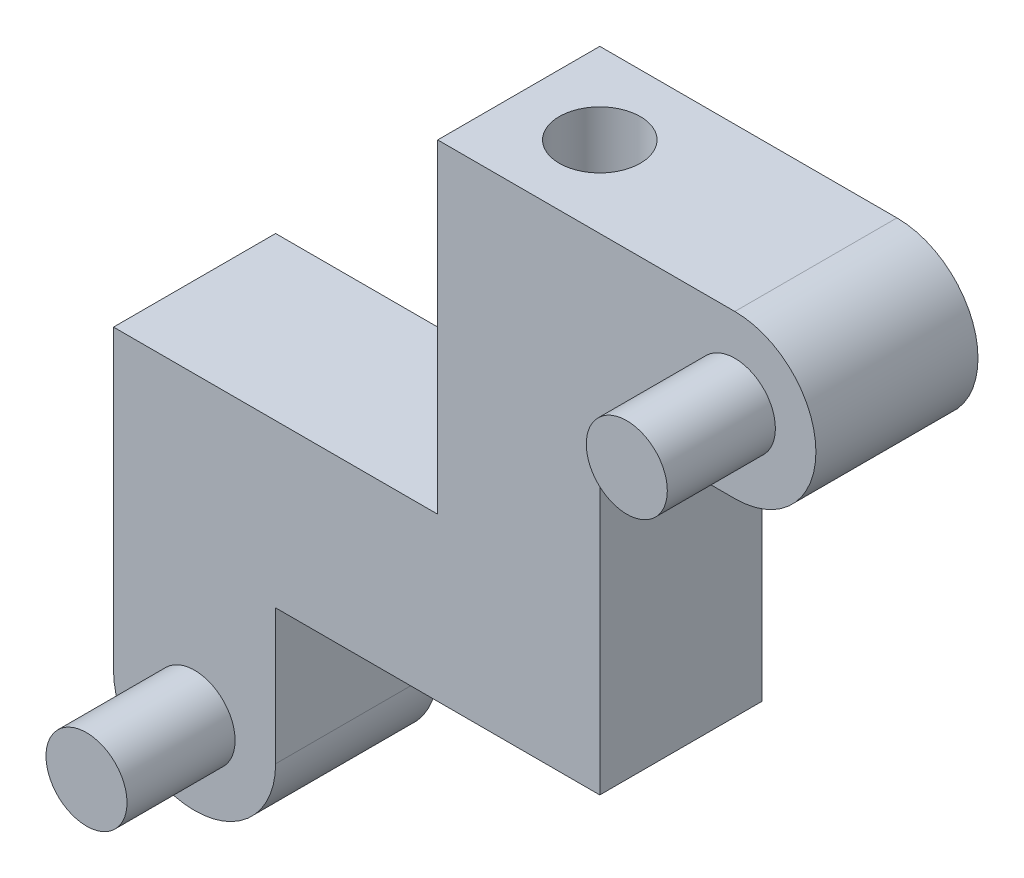
ISO-10303-21;
HEADER;
FILE_DESCRIPTION(('STEP AP214'),'2;1');
FILE_NAME('part.step','',(''),(''),'','','');
FILE_SCHEMA(('AUTOMOTIVE_DESIGN { 1 0 10303 214 1 1 1 1 }'));
ENDSEC;
DATA;
#1=APPLICATION_CONTEXT('core data for automotive mechanical design processes');
#2=APPLICATION_PROTOCOL_DEFINITION('international standard','automotive_design',2000,#1);
#3=PRODUCT_CONTEXT('',#1,'mechanical');
#4=PRODUCT('Part','Part','',(#3));
#5=PRODUCT_RELATED_PRODUCT_CATEGORY('part','',(#4));
#6=PRODUCT_DEFINITION_FORMATION('','',#4);
#7=PRODUCT_DEFINITION_CONTEXT('part definition',#1,'design');
#8=PRODUCT_DEFINITION('design','',#6,#7);
#9=PRODUCT_DEFINITION_SHAPE('','',#8);
#10=(LENGTH_UNIT() NAMED_UNIT(*) SI_UNIT(.MILLI.,.METRE.));
#11=(NAMED_UNIT(*) PLANE_ANGLE_UNIT() SI_UNIT($,.RADIAN.));
#12=(NAMED_UNIT(*) SI_UNIT($,.STERADIAN.) SOLID_ANGLE_UNIT());
#13=UNCERTAINTY_MEASURE_WITH_UNIT(LENGTH_MEASURE(1.E-05),#10,'distance_accuracy_value','');
#14=(GEOMETRIC_REPRESENTATION_CONTEXT(3) GLOBAL_UNCERTAINTY_ASSIGNED_CONTEXT((#13)) GLOBAL_UNIT_ASSIGNED_CONTEXT((#10,
#11,#12)) REPRESENTATION_CONTEXT('',''));
#15=CARTESIAN_POINT('',(0.,0.,0.));
#16=DIRECTION('',(0.,0.,1.));
#17=DIRECTION('',(1.,0.,0.));
#18=AXIS2_PLACEMENT_3D('',#15,#16,#17);
#19=CARTESIAN_POINT('',(30.,30.,30.));
#20=DIRECTION('',(-1.,0.,0.));
#21=DIRECTION('',(0.,-1.,0.));
#22=AXIS2_PLACEMENT_3D('',#19,#20,#21);
#23=PLANE('',#22);
#24=DIRECTION('',(0.,1.,0.));
#25=VECTOR('',#24,1.);
#26=CARTESIAN_POINT('',(30.,30.,0.));
#27=LINE('',#26,#25);
#28=CARTESIAN_POINT('',(30.,-30.0000000000003,0.));
#29=VERTEX_POINT('',#28);
#30=CARTESIAN_POINT('',(30.,30.,0.));
#31=VERTEX_POINT('',#30);
#32=EDGE_CURVE('E122',#29,#31,#27,.T.);
#33=ORIENTED_EDGE('',*,*,#32,.T.);
#34=DIRECTION('',(0.,0.,-1.));
#35=VECTOR('',#34,1.);
#36=CARTESIAN_POINT('',(30.,30.,30.));
#37=LINE('',#36,#35);
#38=CARTESIAN_POINT('',(30.,30.,30.));
#39=VERTEX_POINT('',#38);
#40=EDGE_CURVE('E136',#39,#31,#37,.T.);
#41=ORIENTED_EDGE('',*,*,#40,.F.);
#42=DIRECTION('',(0.,1.,0.));
#43=VECTOR('',#42,1.);
#44=CARTESIAN_POINT('',(30.,30.,30.));
#45=LINE('',#44,#43);
#46=CARTESIAN_POINT('',(30.,-30.0000000000003,30.));
#47=VERTEX_POINT('',#46);
#48=EDGE_CURVE('E92',#47,#39,#45,.T.);
#49=ORIENTED_EDGE('',*,*,#48,.F.);
#50=DIRECTION('',(0.,0.,-1.));
#51=VECTOR('',#50,1.);
#52=CARTESIAN_POINT('',(30.,-30.0000000000003,30.));
#53=LINE('',#52,#51);
#54=EDGE_CURVE('E47',#47,#29,#53,.T.);
#55=ORIENTED_EDGE('',*,*,#54,.T.);
#56=EDGE_LOOP('',(#33,#41,#49,#55));
#57=FACE_BOUND('',#56,.T.);
#58=ADVANCED_FACE('F39',(#57),#23,.F.);
#59=CARTESIAN_POINT('',(55.,30.,30.));
#60=DIRECTION('',(0.,1.,0.));
#61=DIRECTION('',(0.,0.,1.));
#62=AXIS2_PLACEMENT_3D('',#59,#60,#61);
#63=PLANE('',#62);
#64=DIRECTION('',(1.,0.,0.));
#65=VECTOR('',#64,1.);
#66=CARTESIAN_POINT('',(55.,30.,0.));
#67=LINE('',#66,#65);
#68=CARTESIAN_POINT('',(55.,30.,0.));
#69=VERTEX_POINT('',#68);
#70=EDGE_CURVE('E124',#31,#69,#67,.T.);
#71=ORIENTED_EDGE('',*,*,#70,.T.);
#72=DIRECTION('',(0.,0.,-1.));
#73=VECTOR('',#72,1.);
#74=CARTESIAN_POINT('',(55.,30.,30.));
#75=LINE('',#74,#73);
#76=CARTESIAN_POINT('',(55.,30.,30.));
#77=VERTEX_POINT('',#76);
#78=EDGE_CURVE('E113',#77,#69,#75,.T.);
#79=ORIENTED_EDGE('',*,*,#78,.F.);
#80=DIRECTION('',(1.,0.,0.));
#81=VECTOR('',#80,1.);
#82=CARTESIAN_POINT('',(55.,30.,30.));
#83=LINE('',#82,#81);
#84=EDGE_CURVE('E108',#39,#77,#83,.T.);
#85=ORIENTED_EDGE('',*,*,#84,.F.);
#86=ORIENTED_EDGE('',*,*,#40,.T.);
#87=EDGE_LOOP('',(#71,#79,#85,#86));
#88=FACE_BOUND('',#87,.T.);
#89=ADVANCED_FACE('F186',(#88),#63,.F.);
#90=CARTESIAN_POINT('',(55.,45.,30.));
#91=DIRECTION('',(0.,0.,-1.));
#92=DIRECTION('',(-1.,0.,0.));
#93=AXIS2_PLACEMENT_3D('',#90,#91,#92);
#94=CYLINDRICAL_SURFACE('',#93,15.);
#95=CARTESIAN_POINT('',(55.,45.,0.));
#96=DIRECTION('',(0.,0.,1.));
#97=DIRECTION('',(1.,0.,0.));
#98=AXIS2_PLACEMENT_3D('',#95,#96,#97);
#99=CIRCLE('',#98,15.);
#100=CARTESIAN_POINT('',(55.,60.,0.));
#101=VERTEX_POINT('',#100);
#102=EDGE_CURVE('E76',#69,#101,#99,.T.);
#103=ORIENTED_EDGE('',*,*,#102,.T.);
#104=DIRECTION('',(0.,0.,-1.));
#105=VECTOR('',#104,1.);
#106=CARTESIAN_POINT('',(55.,60.,30.));
#107=LINE('',#106,#105);
#108=CARTESIAN_POINT('',(55.,60.,30.));
#109=VERTEX_POINT('',#108);
#110=EDGE_CURVE('E111',#109,#101,#107,.T.);
#111=ORIENTED_EDGE('',*,*,#110,.F.);
#112=CARTESIAN_POINT('',(55.,45.,30.));
#113=DIRECTION('',(0.,0.,1.));
#114=DIRECTION('',(1.,0.,0.));
#115=AXIS2_PLACEMENT_3D('',#112,#113,#114);
#116=CIRCLE('',#115,15.);
#117=EDGE_CURVE('E103',#77,#109,#116,.T.);
#118=ORIENTED_EDGE('',*,*,#117,.F.);
#119=ORIENTED_EDGE('',*,*,#78,.T.);
#120=EDGE_LOOP('',(#103,#111,#118,#119));
#121=FACE_BOUND('',#120,.T.);
#122=ADVANCED_FACE('F112',(#121),#94,.T.);
#123=CARTESIAN_POINT('',(0.,60.,30.));
#124=DIRECTION('',(0.,-1.,0.));
#125=DIRECTION('',(0.,0.,-1.));
#126=AXIS2_PLACEMENT_3D('',#123,#124,#125);
#127=PLANE('',#126);
#128=CARTESIAN_POINT('',(15.,60.,15.));
#129=DIRECTION('',(0.,1.,0.));
#130=DIRECTION('',(0.,0.,1.));
#131=AXIS2_PLACEMENT_3D('',#128,#129,#130);
#132=CIRCLE('',#131,7.5);
#133=CARTESIAN_POINT('',(15.,60.,22.5));
#134=VERTEX_POINT('',#133);
#135=EDGE_CURVE('E172',#134,#134,#132,.T.);
#136=ORIENTED_EDGE('',*,*,#135,.F.);
#137=EDGE_LOOP('',(#136));
#138=FACE_BOUND('',#137,.T.);
#139=DIRECTION('',(-1.,0.,0.));
#140=VECTOR('',#139,1.);
#141=CARTESIAN_POINT('',(0.,60.,0.));
#142=LINE('',#141,#140);
#143=CARTESIAN_POINT('',(0.,60.,0.));
#144=VERTEX_POINT('',#143);
#145=EDGE_CURVE('E83',#101,#144,#142,.T.);
#146=ORIENTED_EDGE('',*,*,#145,.T.);
#147=DIRECTION('',(0.,0.,-1.));
#148=VECTOR('',#147,1.);
#149=CARTESIAN_POINT('',(0.,60.,30.));
#150=LINE('',#149,#148);
#151=CARTESIAN_POINT('',(0.,60.,30.));
#152=VERTEX_POINT('',#151);
#153=EDGE_CURVE('E114',#152,#144,#150,.T.);
#154=ORIENTED_EDGE('',*,*,#153,.F.);
#155=DIRECTION('',(-1.,0.,0.));
#156=VECTOR('',#155,1.);
#157=CARTESIAN_POINT('',(0.,60.,30.));
#158=LINE('',#157,#156);
#159=EDGE_CURVE('E106',#109,#152,#158,.T.);
#160=ORIENTED_EDGE('',*,*,#159,.F.);
#161=ORIENTED_EDGE('',*,*,#110,.T.);
#162=EDGE_LOOP('',(#146,#154,#160,#161));
#163=FACE_BOUND('',#162,.T.);
#164=ADVANCED_FACE('F116',(#138,#163),#127,.F.);
#165=CARTESIAN_POINT('',(0.,0.,30.));
#166=DIRECTION('',(1.,0.,0.));
#167=DIRECTION('',(0.,0.,-1.));
#168=AXIS2_PLACEMENT_3D('',#165,#166,#167);
#169=PLANE('',#168);
#170=DIRECTION('',(0.,-1.,0.));
#171=VECTOR('',#170,1.);
#172=CARTESIAN_POINT('',(0.,0.,0.));
#173=LINE('',#172,#171);
#174=CARTESIAN_POINT('',(0.,0.,0.));
#175=VERTEX_POINT('',#174);
#176=EDGE_CURVE('E129',#144,#175,#173,.T.);
#177=ORIENTED_EDGE('',*,*,#176,.T.);
#178=DIRECTION('',(0.,0.,-1.));
#179=VECTOR('',#178,1.);
#180=CARTESIAN_POINT('',(0.,0.,30.));
#181=LINE('',#180,#179);
#182=CARTESIAN_POINT('',(0.,0.,30.));
#183=VERTEX_POINT('',#182);
#184=EDGE_CURVE('E118',#183,#175,#181,.T.);
#185=ORIENTED_EDGE('',*,*,#184,.F.);
#186=DIRECTION('',(0.,-1.,0.));
#187=VECTOR('',#186,1.);
#188=CARTESIAN_POINT('',(0.,0.,30.));
#189=LINE('',#188,#187);
#190=EDGE_CURVE('E55',#152,#183,#189,.T.);
#191=ORIENTED_EDGE('',*,*,#190,.F.);
#192=ORIENTED_EDGE('',*,*,#153,.T.);
#193=EDGE_LOOP('',(#177,#185,#191,#192));
#194=FACE_BOUND('',#193,.T.);
#195=ADVANCED_FACE('F195',(#194),#169,.F.);
#196=CARTESIAN_POINT('',(55.,45.,30.));
#197=DIRECTION('',(0.,0.,1.));
#198=DIRECTION('',(1.,0.,0.));
#199=AXIS2_PLACEMENT_3D('',#196,#197,#198);
#200=PLANE('',#199);
#201=CARTESIAN_POINT('',(-45.0000000000006,-54.9999999999995,30.));
#202=DIRECTION('',(0.,0.,1.));
#203=DIRECTION('',(1.,0.,0.));
#204=AXIS2_PLACEMENT_3D('',#201,#202,#203);
#205=CIRCLE('',#204,7.5);
#206=CARTESIAN_POINT('',(-37.5000000000006,-54.9999999999995,30.));
#207=VERTEX_POINT('',#206);
#208=EDGE_CURVE('E11',#207,#207,#205,.T.);
#209=ORIENTED_EDGE('',*,*,#208,.F.);
#210=EDGE_LOOP('',(#209));
#211=FACE_BOUND('',#210,.T.);
#212=CARTESIAN_POINT('',(55.,45.,30.));
#213=DIRECTION('',(0.,0.,1.));
#214=DIRECTION('',(1.,0.,0.));
#215=AXIS2_PLACEMENT_3D('',#212,#213,#214);
#216=CIRCLE('',#215,7.5);
#217=CARTESIAN_POINT('',(62.5,45.,30.));
#218=VERTEX_POINT('',#217);
#219=EDGE_CURVE('E176',#218,#218,#216,.T.);
#220=ORIENTED_EDGE('',*,*,#219,.F.);
#221=EDGE_LOOP('',(#220));
#222=FACE_BOUND('',#221,.T.);
#223=ORIENTED_EDGE('',*,*,#190,.T.);
#224=DIRECTION('',(1.,0.,0.));
#225=VECTOR('',#224,1.);
#226=CARTESIAN_POINT('',(0.,0.,30.));
#227=LINE('',#226,#225);
#228=CARTESIAN_POINT('',(-60.,6.12843109593086E-13,30.));
#229=VERTEX_POINT('',#228);
#230=EDGE_CURVE('E151',#229,#183,#227,.T.);
#231=ORIENTED_EDGE('',*,*,#230,.F.);
#232=DIRECTION('',(0.,1.,0.));
#233=VECTOR('',#232,1.);
#234=CARTESIAN_POINT('',(-60.,6.12843109593086E-13,30.));
#235=LINE('',#234,#233);
#236=CARTESIAN_POINT('',(-60.0000000000006,-54.9999999999994,30.));
#237=VERTEX_POINT('',#236);
#238=EDGE_CURVE('E155',#237,#229,#235,.T.);
#239=ORIENTED_EDGE('',*,*,#238,.F.);
#240=CARTESIAN_POINT('',(-45.0000000000006,-54.9999999999995,30.));
#241=DIRECTION('',(0.,0.,-1.));
#242=DIRECTION('',(0.,-1.,0.));
#243=AXIS2_PLACEMENT_3D('',#240,#241,#242);
#244=CIRCLE('',#243,15.);
#245=CARTESIAN_POINT('',(-30.0000000000006,-54.9999999999997,30.));
#246=VERTEX_POINT('',#245);
#247=EDGE_CURVE('E212',#246,#237,#244,.T.);
#248=ORIENTED_EDGE('',*,*,#247,.F.);
#249=DIRECTION('',(0.,-1.,0.));
#250=VECTOR('',#249,1.);
#251=CARTESIAN_POINT('',(-30.0000000000006,-54.9999999999997,30.));
#252=LINE('',#251,#250);
#253=CARTESIAN_POINT('',(-30.0000000000003,-29.9999999999997,30.));
#254=VERTEX_POINT('',#253);
#255=EDGE_CURVE('E214',#254,#246,#252,.T.);
#256=ORIENTED_EDGE('',*,*,#255,.F.);
#257=DIRECTION('',(-1.,0.,0.));
#258=VECTOR('',#257,1.);
#259=CARTESIAN_POINT('',(-30.0000000000003,-29.9999999999997,30.));
#260=LINE('',#259,#258);
#261=EDGE_CURVE('E163',#47,#254,#260,.T.);
#262=ORIENTED_EDGE('',*,*,#261,.F.);
#263=ORIENTED_EDGE('',*,*,#48,.T.);
#264=ORIENTED_EDGE('',*,*,#84,.T.);
#265=ORIENTED_EDGE('',*,*,#117,.T.);
#266=ORIENTED_EDGE('',*,*,#159,.T.);
#267=EDGE_LOOP('',(#223,#231,#239,#248,#256,#262,#263,#264,#265,#266));
#268=FACE_BOUND('',#267,.T.);
#269=ADVANCED_FACE('F104',(#211,#222,#268),#200,.T.);
#270=CARTESIAN_POINT('',(55.,45.,0.));
#271=DIRECTION('',(0.,0.,1.));
#272=DIRECTION('',(1.,0.,0.));
#273=AXIS2_PLACEMENT_3D('',#270,#271,#272);
#274=PLANE('',#273);
#275=ORIENTED_EDGE('',*,*,#32,.F.);
#276=DIRECTION('',(-1.,0.,0.));
#277=VECTOR('',#276,1.);
#278=CARTESIAN_POINT('',(-30.0000000000003,-29.9999999999997,0.));
#279=LINE('',#278,#277);
#280=CARTESIAN_POINT('',(-30.0000000000003,-29.9999999999997,0.));
#281=VERTEX_POINT('',#280);
#282=EDGE_CURVE('E144',#29,#281,#279,.T.);
#283=ORIENTED_EDGE('',*,*,#282,.T.);
#284=DIRECTION('',(0.,-1.,0.));
#285=VECTOR('',#284,1.);
#286=CARTESIAN_POINT('',(-30.0000000000006,-54.9999999999997,0.));
#287=LINE('',#286,#285);
#288=CARTESIAN_POINT('',(-30.0000000000006,-54.9999999999997,0.));
#289=VERTEX_POINT('',#288);
#290=EDGE_CURVE('E152',#281,#289,#287,.T.);
#291=ORIENTED_EDGE('',*,*,#290,.T.);
#292=CARTESIAN_POINT('',(-45.0000000000006,-54.9999999999995,0.));
#293=DIRECTION('',(0.,0.,-1.));
#294=DIRECTION('',(0.,-1.,0.));
#295=AXIS2_PLACEMENT_3D('',#292,#293,#294);
#296=CIRCLE('',#295,15.);
#297=CARTESIAN_POINT('',(-60.0000000000006,-54.9999999999994,0.));
#298=VERTEX_POINT('',#297);
#299=EDGE_CURVE('E157',#289,#298,#296,.T.);
#300=ORIENTED_EDGE('',*,*,#299,.T.);
#301=DIRECTION('',(0.,1.,0.));
#302=VECTOR('',#301,1.);
#303=CARTESIAN_POINT('',(-60.,6.12843109593086E-13,0.));
#304=LINE('',#303,#302);
#305=CARTESIAN_POINT('',(-60.,6.12843109593086E-13,0.));
#306=VERTEX_POINT('',#305);
#307=EDGE_CURVE('E222',#298,#306,#304,.T.);
#308=ORIENTED_EDGE('',*,*,#307,.T.);
#309=DIRECTION('',(1.,0.,0.));
#310=VECTOR('',#309,1.);
#311=CARTESIAN_POINT('',(0.,0.,0.));
#312=LINE('',#311,#310);
#313=EDGE_CURVE('E193',#306,#175,#312,.T.);
#314=ORIENTED_EDGE('',*,*,#313,.T.);
#315=ORIENTED_EDGE('',*,*,#176,.F.);
#316=ORIENTED_EDGE('',*,*,#145,.F.);
#317=ORIENTED_EDGE('',*,*,#102,.F.);
#318=ORIENTED_EDGE('',*,*,#70,.F.);
#319=EDGE_LOOP('',(#275,#283,#291,#300,#308,#314,#315,#316,#317,#318));
#320=FACE_BOUND('',#319,.T.);
#321=ADVANCED_FACE('F187',(#320),#274,.F.);
#322=CARTESIAN_POINT('',(55.,45.,50.));
#323=DIRECTION('',(0.,0.,-1.));
#324=DIRECTION('',(-1.,0.,0.));
#325=AXIS2_PLACEMENT_3D('',#322,#323,#324);
#326=CYLINDRICAL_SURFACE('',#325,7.5);
#327=CARTESIAN_POINT('',(55.,45.,50.));
#328=DIRECTION('',(0.,0.,1.));
#329=DIRECTION('',(1.,0.,0.));
#330=AXIS2_PLACEMENT_3D('',#327,#328,#329);
#331=CIRCLE('',#330,7.5);
#332=CARTESIAN_POINT('',(62.5,45.,50.));
#333=VERTEX_POINT('',#332);
#334=EDGE_CURVE('E125',#333,#333,#331,.T.);
#335=ORIENTED_EDGE('',*,*,#334,.F.);
#336=EDGE_LOOP('',(#335));
#337=FACE_BOUND('',#336,.T.);
#338=ORIENTED_EDGE('',*,*,#219,.T.);
#339=EDGE_LOOP('',(#338));
#340=FACE_BOUND('',#339,.T.);
#341=ADVANCED_FACE('F265',(#337,#340),#326,.T.);
#342=CARTESIAN_POINT('',(55.,45.,50.));
#343=DIRECTION('',(0.,0.,1.));
#344=DIRECTION('',(1.,0.,0.));
#345=AXIS2_PLACEMENT_3D('',#342,#343,#344);
#346=PLANE('',#345);
#347=ORIENTED_EDGE('',*,*,#334,.T.);
#348=EDGE_LOOP('',(#347));
#349=FACE_BOUND('',#348,.T.);
#350=ADVANCED_FACE('F271',(#349),#346,.T.);
#351=CARTESIAN_POINT('',(15.,40.,15.));
#352=DIRECTION('',(0.,1.,0.));
#353=DIRECTION('',(0.,0.,1.));
#354=AXIS2_PLACEMENT_3D('',#351,#352,#353);
#355=CYLINDRICAL_SURFACE('',#354,7.5);
#356=CARTESIAN_POINT('',(15.,40.,15.));
#357=DIRECTION('',(0.,1.,0.));
#358=DIRECTION('',(0.,0.,1.));
#359=AXIS2_PLACEMENT_3D('',#356,#357,#358);
#360=CIRCLE('',#359,7.5);
#361=CARTESIAN_POINT('',(15.,40.,22.5));
#362=VERTEX_POINT('',#361);
#363=EDGE_CURVE('E173',#362,#362,#360,.T.);
#364=ORIENTED_EDGE('',*,*,#363,.F.);
#365=EDGE_LOOP('',(#364));
#366=FACE_BOUND('',#365,.T.);
#367=ORIENTED_EDGE('',*,*,#135,.T.);
#368=EDGE_LOOP('',(#367));
#369=FACE_BOUND('',#368,.T.);
#370=ADVANCED_FACE('F275',(#366,#369),#355,.F.);
#371=CARTESIAN_POINT('',(15.,40.,15.));
#372=DIRECTION('',(0.,1.,0.));
#373=DIRECTION('',(0.,0.,1.));
#374=AXIS2_PLACEMENT_3D('',#371,#372,#373);
#375=PLANE('',#374);
#376=ORIENTED_EDGE('',*,*,#363,.T.);
#377=EDGE_LOOP('',(#376));
#378=FACE_BOUND('',#377,.T.);
#379=ADVANCED_FACE('F279',(#378),#375,.T.);
#380=CARTESIAN_POINT('',(0.,0.,30.));
#381=DIRECTION('',(0.,1.,0.));
#382=DIRECTION('',(-1.,0.,0.));
#383=AXIS2_PLACEMENT_3D('',#380,#381,#382);
#384=PLANE('',#383);
#385=ORIENTED_EDGE('',*,*,#313,.F.);
#386=DIRECTION('',(0.,0.,-1.));
#387=VECTOR('',#386,1.);
#388=CARTESIAN_POINT('',(-60.,6.12843109593086E-13,30.));
#389=LINE('',#388,#387);
#390=EDGE_CURVE('E169',#229,#306,#389,.T.);
#391=ORIENTED_EDGE('',*,*,#390,.F.);
#392=ORIENTED_EDGE('',*,*,#230,.T.);
#393=ORIENTED_EDGE('',*,*,#184,.T.);
#394=EDGE_LOOP('',(#385,#391,#392,#393));
#395=FACE_BOUND('',#394,.T.);
#396=ADVANCED_FACE('F199',(#395),#384,.T.);
#397=CARTESIAN_POINT('',(-60.,6.12843109593086E-13,30.));
#398=DIRECTION('',(-1.,0.,0.));
#399=DIRECTION('',(0.,-1.,0.));
#400=AXIS2_PLACEMENT_3D('',#397,#398,#399);
#401=PLANE('',#400);
#402=CARTESIAN_POINT('',(-60.0000000000002,-14.9999999999994,15.));
#403=DIRECTION('',(1.,0.,0.));
#404=DIRECTION('',(0.,0.,1.));
#405=AXIS2_PLACEMENT_3D('',#402,#403,#404);
#406=CIRCLE('',#405,7.5);
#407=CARTESIAN_POINT('',(-60.0000000000002,-14.9999999999994,22.5));
#408=VERTEX_POINT('',#407);
#409=EDGE_CURVE('E291',#408,#408,#406,.T.);
#410=ORIENTED_EDGE('',*,*,#409,.T.);
#411=EDGE_LOOP('',(#410));
#412=FACE_BOUND('',#411,.T.);
#413=ORIENTED_EDGE('',*,*,#307,.F.);
#414=DIRECTION('',(0.,0.,-1.));
#415=VECTOR('',#414,1.);
#416=CARTESIAN_POINT('',(-60.0000000000006,-54.9999999999994,30.));
#417=LINE('',#416,#415);
#418=EDGE_CURVE('E166',#237,#298,#417,.T.);
#419=ORIENTED_EDGE('',*,*,#418,.F.);
#420=ORIENTED_EDGE('',*,*,#238,.T.);
#421=ORIENTED_EDGE('',*,*,#390,.T.);
#422=EDGE_LOOP('',(#413,#419,#420,#421));
#423=FACE_BOUND('',#422,.T.);
#424=ADVANCED_FACE('F211',(#412,#423),#401,.T.);
#425=CARTESIAN_POINT('',(-45.0000000000006,-54.9999999999995,30.));
#426=DIRECTION('',(0.,0.,-1.));
#427=DIRECTION('',(-1.,0.,0.));
#428=AXIS2_PLACEMENT_3D('',#425,#426,#427);
#429=CYLINDRICAL_SURFACE('',#428,15.);
#430=ORIENTED_EDGE('',*,*,#299,.F.);
#431=DIRECTION('',(0.,0.,-1.));
#432=VECTOR('',#431,1.);
#433=CARTESIAN_POINT('',(-30.0000000000006,-54.9999999999997,30.));
#434=LINE('',#433,#432);
#435=EDGE_CURVE('E162',#246,#289,#434,.T.);
#436=ORIENTED_EDGE('',*,*,#435,.F.);
#437=ORIENTED_EDGE('',*,*,#247,.T.);
#438=ORIENTED_EDGE('',*,*,#418,.T.);
#439=EDGE_LOOP('',(#430,#436,#437,#438));
#440=FACE_BOUND('',#439,.T.);
#441=ADVANCED_FACE('F231',(#440),#429,.T.);
#442=CARTESIAN_POINT('',(-30.0000000000006,-54.9999999999997,30.));
#443=DIRECTION('',(1.,0.,0.));
#444=DIRECTION('',(0.,1.,0.));
#445=AXIS2_PLACEMENT_3D('',#442,#443,#444);
#446=PLANE('',#445);
#447=ORIENTED_EDGE('',*,*,#290,.F.);
#448=DIRECTION('',(0.,0.,-1.));
#449=VECTOR('',#448,1.);
#450=CARTESIAN_POINT('',(-30.0000000000003,-29.9999999999997,30.));
#451=LINE('',#450,#449);
#452=EDGE_CURVE('E147',#254,#281,#451,.T.);
#453=ORIENTED_EDGE('',*,*,#452,.F.);
#454=ORIENTED_EDGE('',*,*,#255,.T.);
#455=ORIENTED_EDGE('',*,*,#435,.T.);
#456=EDGE_LOOP('',(#447,#453,#454,#455));
#457=FACE_BOUND('',#456,.T.);
#458=ADVANCED_FACE('F238',(#457),#446,.T.);
#459=CARTESIAN_POINT('',(-30.0000000000003,-29.9999999999997,30.));
#460=DIRECTION('',(0.,-1.,0.));
#461=DIRECTION('',(1.,0.,0.));
#462=AXIS2_PLACEMENT_3D('',#459,#460,#461);
#463=PLANE('',#462);
#464=ORIENTED_EDGE('',*,*,#282,.F.);
#465=ORIENTED_EDGE('',*,*,#54,.F.);
#466=ORIENTED_EDGE('',*,*,#261,.T.);
#467=ORIENTED_EDGE('',*,*,#452,.T.);
#468=EDGE_LOOP('',(#464,#465,#466,#467));
#469=FACE_BOUND('',#468,.T.);
#470=ADVANCED_FACE('F145',(#469),#463,.T.);
#471=CARTESIAN_POINT('',(-45.0000000000006,-54.9999999999995,50.));
#472=DIRECTION('',(0.,0.,-1.));
#473=DIRECTION('',(-1.,0.,0.));
#474=AXIS2_PLACEMENT_3D('',#471,#472,#473);
#475=CYLINDRICAL_SURFACE('',#474,7.5);
#476=CARTESIAN_POINT('',(-45.0000000000006,-54.9999999999995,50.));
#477=DIRECTION('',(0.,0.,-1.));
#478=DIRECTION('',(0.,-1.,0.));
#479=AXIS2_PLACEMENT_3D('',#476,#477,#478);
#480=CIRCLE('',#479,7.5);
#481=CARTESIAN_POINT('',(-45.0000000000007,-62.4999999999995,50.));
#482=VERTEX_POINT('',#481);
#483=EDGE_CURVE('E223',#482,#482,#480,.T.);
#484=ORIENTED_EDGE('',*,*,#483,.T.);
#485=EDGE_LOOP('',(#484));
#486=FACE_BOUND('',#485,.T.);
#487=ORIENTED_EDGE('',*,*,#208,.T.);
#488=EDGE_LOOP('',(#487));
#489=FACE_BOUND('',#488,.T.);
#490=ADVANCED_FACE('F245',(#486,#489),#475,.T.);
#491=CARTESIAN_POINT('',(-45.0000000000006,-54.9999999999995,50.));
#492=DIRECTION('',(0.,0.,1.));
#493=DIRECTION('',(0.,-1.,0.));
#494=AXIS2_PLACEMENT_3D('',#491,#492,#493);
#495=PLANE('',#494);
#496=ORIENTED_EDGE('',*,*,#483,.F.);
#497=EDGE_LOOP('',(#496));
#498=FACE_BOUND('',#497,.T.);
#499=ADVANCED_FACE('F302',(#498),#495,.T.);
#500=CARTESIAN_POINT('',(-40.0000000000002,-14.9999999999996,15.));
#501=DIRECTION('',(-1.,0.,0.));
#502=DIRECTION('',(0.,-1.,0.));
#503=AXIS2_PLACEMENT_3D('',#500,#501,#502);
#504=CYLINDRICAL_SURFACE('',#503,7.5);
#505=CARTESIAN_POINT('',(-40.0000000000002,-14.9999999999996,15.));
#506=DIRECTION('',(1.,0.,0.));
#507=DIRECTION('',(0.,0.,1.));
#508=AXIS2_PLACEMENT_3D('',#505,#506,#507);
#509=CIRCLE('',#508,7.5);
#510=CARTESIAN_POINT('',(-40.0000000000002,-14.9999999999996,22.5));
#511=VERTEX_POINT('',#510);
#512=EDGE_CURVE('E293',#511,#511,#509,.T.);
#513=ORIENTED_EDGE('',*,*,#512,.T.);
#514=EDGE_LOOP('',(#513));
#515=FACE_BOUND('',#514,.T.);
#516=ORIENTED_EDGE('',*,*,#409,.F.);
#517=EDGE_LOOP('',(#516));
#518=FACE_BOUND('',#517,.T.);
#519=ADVANCED_FACE('F304',(#515,#518),#504,.F.);
#520=CARTESIAN_POINT('',(-40.0000000000002,-14.9999999999996,15.));
#521=DIRECTION('',(-1.,0.,0.));
#522=DIRECTION('',(0.,0.,1.));
#523=AXIS2_PLACEMENT_3D('',#520,#521,#522);
#524=PLANE('',#523);
#525=ORIENTED_EDGE('',*,*,#512,.F.);
#526=EDGE_LOOP('',(#525));
#527=FACE_BOUND('',#526,.T.);
#528=ADVANCED_FACE('F310',(#527),#524,.T.);
#529=CLOSED_SHELL('',(#58,#89,#122,#164,#195,#269,#321,#341,#350,#370,#379,#396,#424,#441,#458,
#470,#490,#499,#519,#528));
#530=MANIFOLD_SOLID_BREP('B2',#529);
#531=ADVANCED_BREP_SHAPE_REPRESENTATION('',(#18,#530),#14);
#532=SHAPE_DEFINITION_REPRESENTATION(#9,#531);
ENDSEC;
END-ISO-10303-21;
